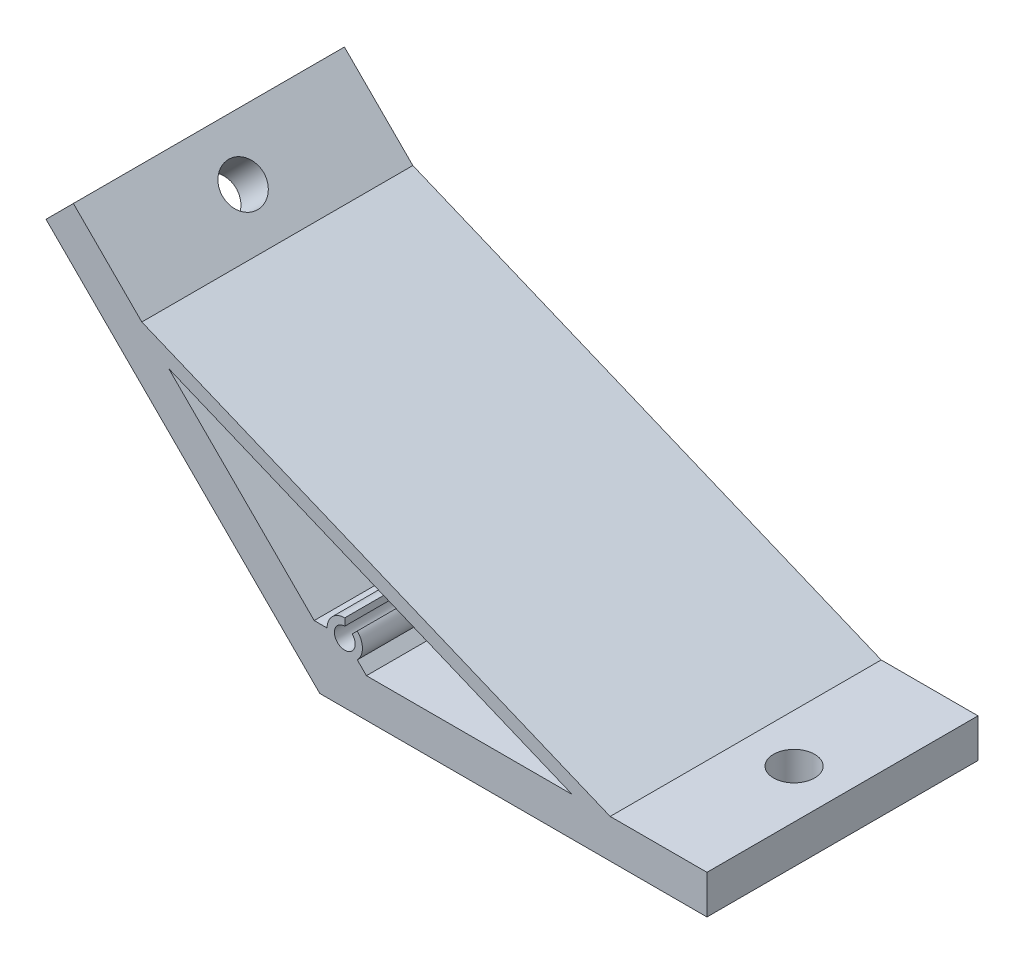
ISO-10303-21;
HEADER;
FILE_DESCRIPTION(('STEP AP214'),'2;1');
FILE_NAME('part.step','',(''),(''),'','','');
FILE_SCHEMA(('AUTOMOTIVE_DESIGN { 1 0 10303 214 1 1 1 1 }'));
ENDSEC;
DATA;
#1=APPLICATION_CONTEXT('core data for automotive mechanical design processes');
#2=APPLICATION_PROTOCOL_DEFINITION('international standard','automotive_design',2000,#1);
#3=PRODUCT_CONTEXT('',#1,'mechanical');
#4=PRODUCT('Part','Part','',(#3));
#5=PRODUCT_RELATED_PRODUCT_CATEGORY('part','',(#4));
#6=PRODUCT_DEFINITION_FORMATION('','',#4);
#7=PRODUCT_DEFINITION_CONTEXT('part definition',#1,'design');
#8=PRODUCT_DEFINITION('design','',#6,#7);
#9=PRODUCT_DEFINITION_SHAPE('','',#8);
#10=(LENGTH_UNIT() NAMED_UNIT(*) SI_UNIT(.MILLI.,.METRE.));
#11=(NAMED_UNIT(*) PLANE_ANGLE_UNIT() SI_UNIT($,.RADIAN.));
#12=(NAMED_UNIT(*) SI_UNIT($,.STERADIAN.) SOLID_ANGLE_UNIT());
#13=UNCERTAINTY_MEASURE_WITH_UNIT(LENGTH_MEASURE(1.E-05),#10,'distance_accuracy_value','');
#14=(GEOMETRIC_REPRESENTATION_CONTEXT(3) GLOBAL_UNCERTAINTY_ASSIGNED_CONTEXT((#13)) GLOBAL_UNIT_ASSIGNED_CONTEXT((#10,
#11,#12)) REPRESENTATION_CONTEXT('',''));
#15=CARTESIAN_POINT('',(0.,0.,0.));
#16=DIRECTION('',(0.,0.,1.));
#17=DIRECTION('',(1.,0.,0.));
#18=AXIS2_PLACEMENT_3D('',#15,#16,#17);
#19=CARTESIAN_POINT('',(-36.7695526216999,48.0832611206847,28.));
#20=DIRECTION('',(-0.707106781186536,-0.707106781186559,0.));
#21=DIRECTION('',(0.707106781186559,-0.707106781186536,0.));
#22=AXIS2_PLACEMENT_3D('',#19,#20,#21);
#23=PLANE('',#22);
#24=DIRECTION('',(-0.707106781186559,0.707106781186536,0.));
#25=VECTOR('',#24,1.);
#26=CARTESIAN_POINT('',(-36.7695526216999,48.0832611206847,-28.));
#27=LINE('',#26,#25);
#28=CARTESIAN_POINT('',(-36.7695526216999,48.0832611206847,-28.));
#29=VERTEX_POINT('',#28);
#30=CARTESIAN_POINT('',(-50.9116882454318,62.2253967444162,-28.));
#31=VERTEX_POINT('',#30);
#32=EDGE_CURVE('E260',#29,#31,#27,.T.);
#33=ORIENTED_EDGE('',*,*,#32,.T.);
#34=DIRECTION('',(0.,0.,-1.));
#35=VECTOR('',#34,1.);
#36=CARTESIAN_POINT('',(-50.9116882454318,62.2253967444162,28.));
#37=LINE('',#36,#35);
#38=CARTESIAN_POINT('',(-50.9116882454318,62.2253967444162,28.));
#39=VERTEX_POINT('',#38);
#40=EDGE_CURVE('E275',#39,#31,#37,.T.);
#41=ORIENTED_EDGE('',*,*,#40,.F.);
#42=DIRECTION('',(-0.707106781186559,0.707106781186536,0.));
#43=VECTOR('',#42,1.);
#44=CARTESIAN_POINT('',(-36.7695526216999,48.0832611206847,28.));
#45=LINE('',#44,#43);
#46=CARTESIAN_POINT('',(-36.7695526216999,48.0832611206847,28.));
#47=VERTEX_POINT('',#46);
#48=EDGE_CURVE('E245',#47,#39,#45,.T.);
#49=ORIENTED_EDGE('',*,*,#48,.F.);
#50=DIRECTION('',(0.,0.,-1.));
#51=VECTOR('',#50,1.);
#52=CARTESIAN_POINT('',(-36.7695526216999,48.0832611206847,28.));
#53=LINE('',#52,#51);
#54=EDGE_CURVE('E278',#47,#29,#53,.T.);
#55=ORIENTED_EDGE('',*,*,#54,.T.);
#56=EDGE_LOOP('',(#33,#41,#49,#55));
#57=FACE_BOUND('',#56,.T.);
#58=CARTESIAN_POINT('',(-43.840620433566,55.1543289325507,0.));
#59=DIRECTION('',(-0.707106781186552,-0.707106781186543,0.));
#60=DIRECTION('',(0.707106781186543,-0.707106781186552,0.));
#61=AXIS2_PLACEMENT_3D('',#58,#59,#60);
#62=CIRCLE('',#61,4.25000000000001);
#63=CARTESIAN_POINT('',(-40.8354166135232,52.1491251125078,0.));
#64=VERTEX_POINT('',#63);
#65=EDGE_CURVE('E325',#64,#64,#62,.T.);
#66=ORIENTED_EDGE('',*,*,#65,.T.);
#67=EDGE_LOOP('',(#66));
#68=FACE_BOUND('',#67,.T.);
#69=ADVANCED_FACE('F35',(#57,#68),#23,.F.);
#70=CARTESIAN_POINT('',(0.,0.,28.));
#71=DIRECTION('',(0.707106781186545,0.70710678118655,0.));
#72=DIRECTION('',(-0.70710678118655,0.707106781186545,0.));
#73=AXIS2_PLACEMENT_3D('',#70,#71,#72);
#74=PLANE('',#73);
#75=DIRECTION('',(0.70710678118655,-0.707106781186545,0.));
#76=VECTOR('',#75,1.);
#77=CARTESIAN_POINT('',(0.,0.,-28.));
#78=LINE('',#77,#76);
#79=CARTESIAN_POINT('',(-56.5685424949243,56.5685424949238,-28.));
#80=VERTEX_POINT('',#79);
#81=CARTESIAN_POINT('',(0.,0.,-28.));
#82=VERTEX_POINT('',#81);
#83=EDGE_CURVE('E264',#80,#82,#78,.T.);
#84=ORIENTED_EDGE('',*,*,#83,.T.);
#85=DIRECTION('',(0.,0.,-1.));
#86=VECTOR('',#85,1.);
#87=CARTESIAN_POINT('',(0.,0.,28.));
#88=LINE('',#87,#86);
#89=CARTESIAN_POINT('',(0.,0.,28.));
#90=VERTEX_POINT('',#89);
#91=EDGE_CURVE('E269',#90,#82,#88,.T.);
#92=ORIENTED_EDGE('',*,*,#91,.F.);
#93=DIRECTION('',(0.70710678118655,-0.707106781186545,0.));
#94=VECTOR('',#93,1.);
#95=CARTESIAN_POINT('',(0.,0.,28.));
#96=LINE('',#95,#94);
#97=CARTESIAN_POINT('',(-56.5685424949243,56.5685424949238,28.));
#98=VERTEX_POINT('',#97);
#99=EDGE_CURVE('E249',#98,#90,#96,.T.);
#100=ORIENTED_EDGE('',*,*,#99,.F.);
#101=DIRECTION('',(0.,0.,-1.));
#102=VECTOR('',#101,1.);
#103=CARTESIAN_POINT('',(-56.5685424949243,56.5685424949238,28.));
#104=LINE('',#103,#102);
#105=EDGE_CURVE('E272',#98,#80,#104,.T.);
#106=ORIENTED_EDGE('',*,*,#105,.T.);
#107=EDGE_LOOP('',(#84,#92,#100,#106));
#108=FACE_BOUND('',#107,.T.);
#109=CARTESIAN_POINT('',(-49.4974746830586,49.4974746830582,0.));
#110=DIRECTION('',(0.707106781186545,0.70710678118655,0.));
#111=DIRECTION('',(-0.70710678118655,0.707106781186545,0.));
#112=AXIS2_PLACEMENT_3D('',#109,#110,#111);
#113=CIRCLE('',#112,4.25000000000001);
#114=CARTESIAN_POINT('',(-52.5026785031014,52.502678503101,0.));
#115=VERTEX_POINT('',#114);
#116=EDGE_CURVE('E39',#115,#115,#113,.F.);
#117=ORIENTED_EDGE('',*,*,#116,.F.);
#118=EDGE_LOOP('',(#117));
#119=FACE_BOUND('',#118,.T.);
#120=ADVANCED_FACE('F317',(#108,#119),#74,.F.);
#121=CARTESIAN_POINT('',(0.,0.,28.));
#122=DIRECTION('',(0.,0.,-1.));
#123=DIRECTION('',(-1.,0.,0.));
#124=AXIS2_PLACEMENT_3D('',#121,#122,#123);
#125=PLANE('',#124);
#126=DIRECTION('',(0.,1.,0.));
#127=VECTOR('',#126,1.);
#128=CARTESIAN_POINT('',(80.,8.,28.));
#129=LINE('',#128,#127);
#130=CARTESIAN_POINT('',(80.,0.,28.));
#131=VERTEX_POINT('',#130);
#132=CARTESIAN_POINT('',(80.,8.,28.));
#133=VERTEX_POINT('',#132);
#134=EDGE_CURVE('E237',#131,#133,#129,.T.);
#135=ORIENTED_EDGE('',*,*,#134,.T.);
#136=DIRECTION('',(-1.,0.,0.));
#137=VECTOR('',#136,1.);
#138=CARTESIAN_POINT('',(80.,8.,28.));
#139=LINE('',#138,#137);
#140=CARTESIAN_POINT('',(59.9999999999991,7.99999999999989,28.));
#141=VERTEX_POINT('',#140);
#142=EDGE_CURVE('E240',#133,#141,#139,.T.);
#143=ORIENTED_EDGE('',*,*,#142,.T.);
#144=DIRECTION('',(-0.923879532511286,0.382683432365092,0.));
#145=VECTOR('',#144,1.);
#146=CARTESIAN_POINT('',(-36.7695526216999,48.0832611206847,28.));
#147=LINE('',#146,#145);
#148=EDGE_CURVE('E243',#141,#47,#147,.T.);
#149=ORIENTED_EDGE('',*,*,#148,.T.);
#150=ORIENTED_EDGE('',*,*,#48,.T.);
#151=DIRECTION('',(-0.707106781186548,-0.707106781186548,0.));
#152=VECTOR('',#151,1.);
#153=CARTESIAN_POINT('',(-50.9116882454318,62.2253967444162,28.));
#154=LINE('',#153,#152);
#155=EDGE_CURVE('E247',#39,#98,#154,.T.);
#156=ORIENTED_EDGE('',*,*,#155,.T.);
#157=ORIENTED_EDGE('',*,*,#99,.T.);
#158=DIRECTION('',(1.,0.,0.));
#159=VECTOR('',#158,1.);
#160=CARTESIAN_POINT('',(80.,0.,28.));
#161=LINE('',#160,#159);
#162=EDGE_CURVE('E251',#90,#131,#161,.T.);
#163=ORIENTED_EDGE('',*,*,#162,.T.);
#164=EDGE_LOOP('',(#135,#143,#149,#150,#156,#157,#163));
#165=FACE_BOUND('',#164,.T.);
#166=DIRECTION('',(-0.92387953251129,0.382683432365082,0.));
#167=VECTOR('',#166,1.);
#168=CARTESIAN_POINT('',(-31.2262754266308,42.5399839256161,28.));
#169=LINE('',#168,#167);
#170=CARTESIAN_POINT('',(52.1606222107425,7.99999999999989,28.));
#171=VERTEX_POINT('',#170);
#172=CARTESIAN_POINT('',(-31.2262754266308,42.5399839256161,28.));
#173=VERTEX_POINT('',#172);
#174=EDGE_CURVE('E155',#171,#173,#169,.T.);
#175=ORIENTED_EDGE('',*,*,#174,.F.);
#176=DIRECTION('',(1.,0.,0.));
#177=VECTOR('',#176,1.);
#178=CARTESIAN_POINT('',(52.1606222107425,7.99999999999989,28.));
#179=LINE('',#178,#177);
#180=CARTESIAN_POINT('',(9.63860002583124,8.,28.));
#181=VERTEX_POINT('',#180);
#182=EDGE_CURVE('E194',#181,#171,#179,.T.);
#183=ORIENTED_EDGE('',*,*,#182,.F.);
#184=DIRECTION('',(0.70710678118647,-0.707106781186625,0.));
#185=VECTOR('',#184,1.);
#186=CARTESIAN_POINT('',(9.63860002583124,8.,28.));
#187=LINE('',#186,#185);
#188=CARTESIAN_POINT('',(7.74716608826006,9.89143393757159,28.));
#189=VERTEX_POINT('',#188);
#190=EDGE_CURVE('E192',#189,#181,#187,.T.);
#191=ORIENTED_EDGE('',*,*,#190,.F.);
#192=CARTESIAN_POINT('',(5.16622633692896,12.4723736889023,28.));
#193=DIRECTION('',(0.,0.,-1.));
#194=DIRECTION('',(1.,0.,0.));
#195=AXIS2_PLACEMENT_3D('',#192,#193,#194);
#196=CIRCLE('',#195,3.65);
#197=CARTESIAN_POINT('',(7.74716608826007,15.053313440233,28.));
#198=VERTEX_POINT('',#197);
#199=EDGE_CURVE('E190',#198,#189,#196,.T.);
#200=ORIENTED_EDGE('',*,*,#199,.F.);
#201=DIRECTION('',(0.707106781186523,0.707106781186572,0.));
#202=VECTOR('',#201,1.);
#203=CARTESIAN_POINT('',(6.68650591648028,13.9926532684531,28.));
#204=LINE('',#203,#202);
#205=CARTESIAN_POINT('',(6.68650591648028,13.9926532684531,28.));
#206=VERTEX_POINT('',#205);
#207=EDGE_CURVE('E188',#206,#198,#204,.T.);
#208=ORIENTED_EDGE('',*,*,#207,.F.);
#209=CARTESIAN_POINT('',(5.16622633692896,12.4723736889023,28.));
#210=DIRECTION('',(0.,0.,1.));
#211=DIRECTION('',(1.,0.,0.));
#212=AXIS2_PLACEMENT_3D('',#209,#210,#211);
#213=CIRCLE('',#212,2.15);
#214=CARTESIAN_POINT('',(5.16622633692896,14.6223736889023,28.));
#215=VERTEX_POINT('',#214);
#216=EDGE_CURVE('E186',#215,#206,#213,.T.);
#217=ORIENTED_EDGE('',*,*,#216,.F.);
#218=DIRECTION('',(0.,-1.,0.));
#219=VECTOR('',#218,1.);
#220=CARTESIAN_POINT('',(5.16622633692896,14.6223736889023,28.));
#221=LINE('',#220,#219);
#222=CARTESIAN_POINT('',(5.16622633692896,16.1223736889023,28.));
#223=VERTEX_POINT('',#222);
#224=EDGE_CURVE('E184',#223,#215,#221,.T.);
#225=ORIENTED_EDGE('',*,*,#224,.F.);
#226=CARTESIAN_POINT('',(5.16622633692896,12.4723736889023,28.));
#227=DIRECTION('',(0.,0.,-1.));
#228=DIRECTION('',(1.,0.,0.));
#229=AXIS2_PLACEMENT_3D('',#226,#227,#228);
#230=CIRCLE('',#229,3.65);
#231=CARTESIAN_POINT('',(1.51622633692896,12.4723736889023,28.));
#232=VERTEX_POINT('',#231);
#233=EDGE_CURVE('E179',#232,#223,#230,.T.);
#234=ORIENTED_EDGE('',*,*,#233,.F.);
#235=DIRECTION('',(1.,0.,0.));
#236=VECTOR('',#235,1.);
#237=CARTESIAN_POINT('',(-1.15866518991743,12.4723736889023,28.));
#238=LINE('',#237,#236);
#239=CARTESIAN_POINT('',(-1.15866518991743,12.4723736889023,28.));
#240=VERTEX_POINT('',#239);
#241=EDGE_CURVE('E177',#240,#232,#238,.T.);
#242=ORIENTED_EDGE('',*,*,#241,.F.);
#243=DIRECTION('',(0.707106781186542,-0.707106781186553,0.));
#244=VECTOR('',#243,1.);
#245=CARTESIAN_POINT('',(-1.15866518991743,12.4723736889023,28.));
#246=LINE('',#245,#244);
#247=EDGE_CURVE('E163',#173,#240,#246,.T.);
#248=ORIENTED_EDGE('',*,*,#247,.F.);
#249=EDGE_LOOP('',(#175,#183,#191,#200,#208,#217,#225,#234,#242,#248));
#250=FACE_BOUND('',#249,.T.);
#251=ADVANCED_FACE('F175',(#165,#250),#125,.F.);
#252=CARTESIAN_POINT('',(0.,0.,-28.));
#253=DIRECTION('',(0.,0.,-1.));
#254=DIRECTION('',(-1.,0.,0.));
#255=AXIS2_PLACEMENT_3D('',#252,#253,#254);
#256=PLANE('',#255);
#257=DIRECTION('',(0.,1.,0.));
#258=VECTOR('',#257,1.);
#259=CARTESIAN_POINT('',(80.,8.,-28.));
#260=LINE('',#259,#258);
#261=CARTESIAN_POINT('',(80.,0.,-28.));
#262=VERTEX_POINT('',#261);
#263=CARTESIAN_POINT('',(80.,8.,-28.));
#264=VERTEX_POINT('',#263);
#265=EDGE_CURVE('E171',#262,#264,#260,.T.);
#266=ORIENTED_EDGE('',*,*,#265,.F.);
#267=DIRECTION('',(1.,0.,0.));
#268=VECTOR('',#267,1.);
#269=CARTESIAN_POINT('',(80.,0.,-28.));
#270=LINE('',#269,#268);
#271=EDGE_CURVE('E241',#82,#262,#270,.T.);
#272=ORIENTED_EDGE('',*,*,#271,.F.);
#273=ORIENTED_EDGE('',*,*,#83,.F.);
#274=DIRECTION('',(-0.707106781186548,-0.707106781186548,0.));
#275=VECTOR('',#274,1.);
#276=CARTESIAN_POINT('',(-50.9116882454318,62.2253967444162,-28.));
#277=LINE('',#276,#275);
#278=EDGE_CURVE('E262',#31,#80,#277,.T.);
#279=ORIENTED_EDGE('',*,*,#278,.F.);
#280=ORIENTED_EDGE('',*,*,#32,.F.);
#281=DIRECTION('',(-0.923879532511286,0.382683432365092,0.));
#282=VECTOR('',#281,1.);
#283=CARTESIAN_POINT('',(-36.7695526216999,48.0832611206847,-28.));
#284=LINE('',#283,#282);
#285=CARTESIAN_POINT('',(59.9999999999991,7.99999999999989,-28.));
#286=VERTEX_POINT('',#285);
#287=EDGE_CURVE('E258',#286,#29,#284,.T.);
#288=ORIENTED_EDGE('',*,*,#287,.F.);
#289=DIRECTION('',(-1.,0.,0.));
#290=VECTOR('',#289,1.);
#291=CARTESIAN_POINT('',(80.,8.,-28.));
#292=LINE('',#291,#290);
#293=EDGE_CURVE('E256',#264,#286,#292,.T.);
#294=ORIENTED_EDGE('',*,*,#293,.F.);
#295=EDGE_LOOP('',(#266,#272,#273,#279,#280,#288,#294));
#296=FACE_BOUND('',#295,.T.);
#297=DIRECTION('',(1.,0.,0.));
#298=VECTOR('',#297,1.);
#299=CARTESIAN_POINT('',(52.1606222107425,7.99999999999989,-28.));
#300=LINE('',#299,#298);
#301=CARTESIAN_POINT('',(9.63860002583124,8.,-28.));
#302=VERTEX_POINT('',#301);
#303=CARTESIAN_POINT('',(52.1606222107425,7.99999999999989,-28.));
#304=VERTEX_POINT('',#303);
#305=EDGE_CURVE('E164',#302,#304,#300,.T.);
#306=ORIENTED_EDGE('',*,*,#305,.T.);
#307=DIRECTION('',(-0.92387953251129,0.382683432365082,0.));
#308=VECTOR('',#307,1.);
#309=CARTESIAN_POINT('',(-31.2262754266308,42.5399839256161,-28.));
#310=LINE('',#309,#308);
#311=CARTESIAN_POINT('',(-31.2262754266308,42.5399839256161,-28.));
#312=VERTEX_POINT('',#311);
#313=EDGE_CURVE('E59',#304,#312,#310,.T.);
#314=ORIENTED_EDGE('',*,*,#313,.T.);
#315=DIRECTION('',(0.707106781186542,-0.707106781186553,0.));
#316=VECTOR('',#315,1.);
#317=CARTESIAN_POINT('',(-1.15866518991743,12.4723736889023,-28.));
#318=LINE('',#317,#316);
#319=CARTESIAN_POINT('',(-1.15866518991743,12.4723736889023,-28.));
#320=VERTEX_POINT('',#319);
#321=EDGE_CURVE('E170',#312,#320,#318,.T.);
#322=ORIENTED_EDGE('',*,*,#321,.T.);
#323=DIRECTION('',(1.,0.,0.));
#324=VECTOR('',#323,1.);
#325=CARTESIAN_POINT('',(-1.15866518991743,12.4723736889023,-28.));
#326=LINE('',#325,#324);
#327=CARTESIAN_POINT('',(1.51622633692896,12.4723736889023,-28.));
#328=VERTEX_POINT('',#327);
#329=EDGE_CURVE('E199',#320,#328,#326,.T.);
#330=ORIENTED_EDGE('',*,*,#329,.T.);
#331=CARTESIAN_POINT('',(5.16622633692896,12.4723736889023,-28.));
#332=DIRECTION('',(0.,0.,-1.));
#333=DIRECTION('',(1.,0.,0.));
#334=AXIS2_PLACEMENT_3D('',#331,#332,#333);
#335=CIRCLE('',#334,3.65);
#336=CARTESIAN_POINT('',(5.16622633692896,16.1223736889023,-28.));
#337=VERTEX_POINT('',#336);
#338=EDGE_CURVE('E202',#328,#337,#335,.T.);
#339=ORIENTED_EDGE('',*,*,#338,.T.);
#340=DIRECTION('',(0.,-1.,0.));
#341=VECTOR('',#340,1.);
#342=CARTESIAN_POINT('',(5.16622633692896,14.6223736889023,-28.));
#343=LINE('',#342,#341);
#344=CARTESIAN_POINT('',(5.16622633692896,14.6223736889023,-28.));
#345=VERTEX_POINT('',#344);
#346=EDGE_CURVE('E205',#337,#345,#343,.T.);
#347=ORIENTED_EDGE('',*,*,#346,.T.);
#348=CARTESIAN_POINT('',(5.16622633692896,12.4723736889023,-28.));
#349=DIRECTION('',(0.,0.,1.));
#350=DIRECTION('',(1.,0.,0.));
#351=AXIS2_PLACEMENT_3D('',#348,#349,#350);
#352=CIRCLE('',#351,2.15);
#353=CARTESIAN_POINT('',(6.68650591648028,13.9926532684531,-28.));
#354=VERTEX_POINT('',#353);
#355=EDGE_CURVE('E208',#345,#354,#352,.T.);
#356=ORIENTED_EDGE('',*,*,#355,.T.);
#357=DIRECTION('',(0.707106781186523,0.707106781186572,0.));
#358=VECTOR('',#357,1.);
#359=CARTESIAN_POINT('',(6.68650591648028,13.9926532684531,-28.));
#360=LINE('',#359,#358);
#361=CARTESIAN_POINT('',(7.74716608826007,15.053313440233,-28.));
#362=VERTEX_POINT('',#361);
#363=EDGE_CURVE('E211',#354,#362,#360,.T.);
#364=ORIENTED_EDGE('',*,*,#363,.T.);
#365=CARTESIAN_POINT('',(5.16622633692896,12.4723736889023,-28.));
#366=DIRECTION('',(0.,0.,-1.));
#367=DIRECTION('',(1.,0.,0.));
#368=AXIS2_PLACEMENT_3D('',#365,#366,#367);
#369=CIRCLE('',#368,3.65);
#370=CARTESIAN_POINT('',(7.74716608826006,9.89143393757159,-28.));
#371=VERTEX_POINT('',#370);
#372=EDGE_CURVE('E214',#362,#371,#369,.T.);
#373=ORIENTED_EDGE('',*,*,#372,.T.);
#374=DIRECTION('',(0.70710678118647,-0.707106781186625,0.));
#375=VECTOR('',#374,1.);
#376=CARTESIAN_POINT('',(9.63860002583124,8.,-28.));
#377=LINE('',#376,#375);
#378=EDGE_CURVE('E217',#371,#302,#377,.T.);
#379=ORIENTED_EDGE('',*,*,#378,.T.);
#380=EDGE_LOOP('',(#306,#314,#322,#330,#339,#347,#356,#364,#373,#379));
#381=FACE_BOUND('',#380,.T.);
#382=ADVANCED_FACE('F292',(#296,#381),#256,.T.);
#383=CARTESIAN_POINT('',(80.,8.,28.));
#384=DIRECTION('',(-1.,0.,0.));
#385=DIRECTION('',(0.,0.,1.));
#386=AXIS2_PLACEMENT_3D('',#383,#384,#385);
#387=PLANE('',#386);
#388=ORIENTED_EDGE('',*,*,#265,.T.);
#389=DIRECTION('',(0.,0.,-1.));
#390=VECTOR('',#389,1.);
#391=CARTESIAN_POINT('',(80.,8.,28.));
#392=LINE('',#391,#390);
#393=EDGE_CURVE('E11',#133,#264,#392,.T.);
#394=ORIENTED_EDGE('',*,*,#393,.F.);
#395=ORIENTED_EDGE('',*,*,#134,.F.);
#396=DIRECTION('',(0.,0.,-1.));
#397=VECTOR('',#396,1.);
#398=CARTESIAN_POINT('',(80.,0.,28.));
#399=LINE('',#398,#397);
#400=EDGE_CURVE('E253',#131,#262,#399,.T.);
#401=ORIENTED_EDGE('',*,*,#400,.T.);
#402=EDGE_LOOP('',(#388,#394,#395,#401));
#403=FACE_BOUND('',#402,.T.);
#404=ADVANCED_FACE('F37',(#403),#387,.F.);
#405=CARTESIAN_POINT('',(80.,8.,28.));
#406=DIRECTION('',(0.,-1.,0.));
#407=DIRECTION('',(1.,0.,0.));
#408=AXIS2_PLACEMENT_3D('',#405,#406,#407);
#409=PLANE('',#408);
#410=CARTESIAN_POINT('',(70.,7.99999999999994,0.));
#411=DIRECTION('',(0.,1.,0.));
#412=DIRECTION('',(-1.,0.,0.));
#413=AXIS2_PLACEMENT_3D('',#410,#411,#412);
#414=CIRCLE('',#413,4.25000000000001);
#415=CARTESIAN_POINT('',(65.75,7.99999999999992,0.));
#416=VERTEX_POINT('',#415);
#417=EDGE_CURVE('E324',#416,#416,#414,.T.);
#418=ORIENTED_EDGE('',*,*,#417,.F.);
#419=EDGE_LOOP('',(#418));
#420=FACE_BOUND('',#419,.T.);
#421=ORIENTED_EDGE('',*,*,#293,.T.);
#422=DIRECTION('',(0.,0.,-1.));
#423=VECTOR('',#422,1.);
#424=CARTESIAN_POINT('',(59.9999999999991,7.99999999999989,28.));
#425=LINE('',#424,#423);
#426=EDGE_CURVE('E44',#141,#286,#425,.T.);
#427=ORIENTED_EDGE('',*,*,#426,.F.);
#428=ORIENTED_EDGE('',*,*,#142,.F.);
#429=ORIENTED_EDGE('',*,*,#393,.T.);
#430=EDGE_LOOP('',(#421,#427,#428,#429));
#431=FACE_BOUND('',#430,.T.);
#432=ADVANCED_FACE('F309',(#420,#431),#409,.F.);
#433=CARTESIAN_POINT('',(-36.7695526216999,48.0832611206847,28.));
#434=DIRECTION('',(-0.382683432365092,-0.923879532511286,0.));
#435=DIRECTION('',(0.923879532511286,-0.382683432365092,0.));
#436=AXIS2_PLACEMENT_3D('',#433,#434,#435);
#437=PLANE('',#436);
#438=ORIENTED_EDGE('',*,*,#287,.T.);
#439=ORIENTED_EDGE('',*,*,#54,.F.);
#440=ORIENTED_EDGE('',*,*,#148,.F.);
#441=ORIENTED_EDGE('',*,*,#426,.T.);
#442=EDGE_LOOP('',(#438,#439,#440,#441));
#443=FACE_BOUND('',#442,.T.);
#444=ADVANCED_FACE('F286',(#443),#437,.F.);
#445=CARTESIAN_POINT('',(-50.9116882454318,62.2253967444162,28.));
#446=DIRECTION('',(0.707106781186547,-0.707106781186547,0.));
#447=DIRECTION('',(0.707106781186548,0.707106781186548,0.));
#448=AXIS2_PLACEMENT_3D('',#445,#446,#447);
#449=PLANE('',#448);
#450=ORIENTED_EDGE('',*,*,#278,.T.);
#451=ORIENTED_EDGE('',*,*,#105,.F.);
#452=ORIENTED_EDGE('',*,*,#155,.F.);
#453=ORIENTED_EDGE('',*,*,#40,.T.);
#454=EDGE_LOOP('',(#450,#451,#452,#453));
#455=FACE_BOUND('',#454,.T.);
#456=ADVANCED_FACE('F302',(#455),#449,.F.);
#457=CARTESIAN_POINT('',(80.,0.,28.));
#458=DIRECTION('',(0.,1.,0.));
#459=DIRECTION('',(0.,0.,1.));
#460=AXIS2_PLACEMENT_3D('',#457,#458,#459);
#461=PLANE('',#460);
#462=CARTESIAN_POINT('',(70.,0.,0.));
#463=DIRECTION('',(0.,1.,0.));
#464=DIRECTION('',(-1.,0.,0.));
#465=AXIS2_PLACEMENT_3D('',#462,#463,#464);
#466=CIRCLE('',#465,4.25000000000001);
#467=CARTESIAN_POINT('',(65.75,0.,0.));
#468=VERTEX_POINT('',#467);
#469=EDGE_CURVE('E197',#468,#468,#466,.T.);
#470=ORIENTED_EDGE('',*,*,#469,.T.);
#471=EDGE_LOOP('',(#470));
#472=FACE_BOUND('',#471,.T.);
#473=ORIENTED_EDGE('',*,*,#271,.T.);
#474=ORIENTED_EDGE('',*,*,#400,.F.);
#475=ORIENTED_EDGE('',*,*,#162,.F.);
#476=ORIENTED_EDGE('',*,*,#91,.T.);
#477=EDGE_LOOP('',(#473,#474,#475,#476));
#478=FACE_BOUND('',#477,.T.);
#479=ADVANCED_FACE('F314',(#472,#478),#461,.F.);
#480=CARTESIAN_POINT('',(-31.2262754266308,42.5399839256161,28.));
#481=DIRECTION('',(-0.382683432365082,-0.92387953251129,0.));
#482=DIRECTION('',(0.92387953251129,-0.382683432365082,0.));
#483=AXIS2_PLACEMENT_3D('',#480,#481,#482);
#484=PLANE('',#483);
#485=ORIENTED_EDGE('',*,*,#313,.F.);
#486=DIRECTION('',(0.,0.,-1.));
#487=VECTOR('',#486,1.);
#488=CARTESIAN_POINT('',(52.1606222107425,7.99999999999989,28.));
#489=LINE('',#488,#487);
#490=EDGE_CURVE('E159',#171,#304,#489,.T.);
#491=ORIENTED_EDGE('',*,*,#490,.F.);
#492=ORIENTED_EDGE('',*,*,#174,.T.);
#493=DIRECTION('',(0.,0.,-1.));
#494=VECTOR('',#493,1.);
#495=CARTESIAN_POINT('',(-31.2262754266308,42.5399839256161,28.));
#496=LINE('',#495,#494);
#497=EDGE_CURVE('E158',#173,#312,#496,.T.);
#498=ORIENTED_EDGE('',*,*,#497,.T.);
#499=EDGE_LOOP('',(#485,#491,#492,#498));
#500=FACE_BOUND('',#499,.T.);
#501=ADVANCED_FACE('F157',(#500),#484,.T.);
#502=CARTESIAN_POINT('',(-1.15866518991743,12.4723736889023,28.));
#503=DIRECTION('',(0.707106781186553,0.707106781186542,0.));
#504=DIRECTION('',(-0.707106781186542,0.707106781186553,0.));
#505=AXIS2_PLACEMENT_3D('',#502,#503,#504);
#506=PLANE('',#505);
#507=ORIENTED_EDGE('',*,*,#321,.F.);
#508=ORIENTED_EDGE('',*,*,#497,.F.);
#509=ORIENTED_EDGE('',*,*,#247,.T.);
#510=DIRECTION('',(0.,0.,-1.));
#511=VECTOR('',#510,1.);
#512=CARTESIAN_POINT('',(-1.15866518991743,12.4723736889023,28.));
#513=LINE('',#512,#511);
#514=EDGE_CURVE('E172',#240,#320,#513,.T.);
#515=ORIENTED_EDGE('',*,*,#514,.T.);
#516=EDGE_LOOP('',(#507,#508,#509,#515));
#517=FACE_BOUND('',#516,.T.);
#518=ADVANCED_FACE('F167',(#517),#506,.T.);
#519=CARTESIAN_POINT('',(-1.15866518991743,12.4723736889023,28.));
#520=DIRECTION('',(0.,1.,0.));
#521=DIRECTION('',(0.,0.,1.));
#522=AXIS2_PLACEMENT_3D('',#519,#520,#521);
#523=PLANE('',#522);
#524=ORIENTED_EDGE('',*,*,#329,.F.);
#525=ORIENTED_EDGE('',*,*,#514,.F.);
#526=ORIENTED_EDGE('',*,*,#241,.T.);
#527=DIRECTION('',(0.,0.,-1.));
#528=VECTOR('',#527,1.);
#529=CARTESIAN_POINT('',(1.51622633692896,12.4723736889023,28.));
#530=LINE('',#529,#528);
#531=EDGE_CURVE('E234',#232,#328,#530,.T.);
#532=ORIENTED_EDGE('',*,*,#531,.T.);
#533=EDGE_LOOP('',(#524,#525,#526,#532));
#534=FACE_BOUND('',#533,.T.);
#535=ADVANCED_FACE('F366',(#534),#523,.T.);
#536=CARTESIAN_POINT('',(5.16622633692896,12.4723736889023,28.));
#537=DIRECTION('',(0.,0.,-1.));
#538=DIRECTION('',(-1.,0.,0.));
#539=AXIS2_PLACEMENT_3D('',#536,#537,#538);
#540=CYLINDRICAL_SURFACE('',#539,3.65);
#541=ORIENTED_EDGE('',*,*,#338,.F.);
#542=ORIENTED_EDGE('',*,*,#531,.F.);
#543=ORIENTED_EDGE('',*,*,#233,.T.);
#544=DIRECTION('',(0.,0.,-1.));
#545=VECTOR('',#544,1.);
#546=CARTESIAN_POINT('',(5.16622633692896,16.1223736889023,28.));
#547=LINE('',#546,#545);
#548=EDGE_CURVE('E232',#223,#337,#547,.T.);
#549=ORIENTED_EDGE('',*,*,#548,.T.);
#550=EDGE_LOOP('',(#541,#542,#543,#549));
#551=FACE_BOUND('',#550,.T.);
#552=ADVANCED_FACE('F369',(#551),#540,.T.);
#553=CARTESIAN_POINT('',(5.16622633692896,14.6223736889023,28.));
#554=DIRECTION('',(1.,0.,0.));
#555=DIRECTION('',(0.,0.,-1.));
#556=AXIS2_PLACEMENT_3D('',#553,#554,#555);
#557=PLANE('',#556);
#558=ORIENTED_EDGE('',*,*,#346,.F.);
#559=ORIENTED_EDGE('',*,*,#548,.F.);
#560=ORIENTED_EDGE('',*,*,#224,.T.);
#561=DIRECTION('',(0.,0.,-1.));
#562=VECTOR('',#561,1.);
#563=CARTESIAN_POINT('',(5.16622633692896,14.6223736889023,28.));
#564=LINE('',#563,#562);
#565=EDGE_CURVE('E230',#215,#345,#564,.T.);
#566=ORIENTED_EDGE('',*,*,#565,.T.);
#567=EDGE_LOOP('',(#558,#559,#560,#566));
#568=FACE_BOUND('',#567,.T.);
#569=ADVANCED_FACE('F373',(#568),#557,.T.);
#570=CARTESIAN_POINT('',(5.16622633692896,12.4723736889023,28.));
#571=DIRECTION('',(0.,0.,-1.));
#572=DIRECTION('',(-1.,0.,0.));
#573=AXIS2_PLACEMENT_3D('',#570,#571,#572);
#574=CYLINDRICAL_SURFACE('',#573,2.15);
#575=ORIENTED_EDGE('',*,*,#355,.F.);
#576=ORIENTED_EDGE('',*,*,#565,.F.);
#577=ORIENTED_EDGE('',*,*,#216,.T.);
#578=DIRECTION('',(0.,0.,-1.));
#579=VECTOR('',#578,1.);
#580=CARTESIAN_POINT('',(6.68650591648028,13.9926532684531,28.));
#581=LINE('',#580,#579);
#582=EDGE_CURVE('E228',#206,#354,#581,.T.);
#583=ORIENTED_EDGE('',*,*,#582,.T.);
#584=EDGE_LOOP('',(#575,#576,#577,#583));
#585=FACE_BOUND('',#584,.T.);
#586=ADVANCED_FACE('F377',(#585),#574,.F.);
#587=CARTESIAN_POINT('',(6.68650591648028,13.9926532684531,28.));
#588=DIRECTION('',(-0.707106781186572,0.707106781186523,0.));
#589=DIRECTION('',(-0.707106781186523,-0.707106781186572,0.));
#590=AXIS2_PLACEMENT_3D('',#587,#588,#589);
#591=PLANE('',#590);
#592=ORIENTED_EDGE('',*,*,#363,.F.);
#593=ORIENTED_EDGE('',*,*,#582,.F.);
#594=ORIENTED_EDGE('',*,*,#207,.T.);
#595=DIRECTION('',(0.,0.,-1.));
#596=VECTOR('',#595,1.);
#597=CARTESIAN_POINT('',(7.74716608826007,15.053313440233,28.));
#598=LINE('',#597,#596);
#599=EDGE_CURVE('E226',#198,#362,#598,.T.);
#600=ORIENTED_EDGE('',*,*,#599,.T.);
#601=EDGE_LOOP('',(#592,#593,#594,#600));
#602=FACE_BOUND('',#601,.T.);
#603=ADVANCED_FACE('F381',(#602),#591,.T.);
#604=CARTESIAN_POINT('',(5.16622633692896,12.4723736889023,28.));
#605=DIRECTION('',(0.,0.,-1.));
#606=DIRECTION('',(-1.,0.,0.));
#607=AXIS2_PLACEMENT_3D('',#604,#605,#606);
#608=CYLINDRICAL_SURFACE('',#607,3.65);
#609=ORIENTED_EDGE('',*,*,#372,.F.);
#610=ORIENTED_EDGE('',*,*,#599,.F.);
#611=ORIENTED_EDGE('',*,*,#199,.T.);
#612=DIRECTION('',(0.,0.,-1.));
#613=VECTOR('',#612,1.);
#614=CARTESIAN_POINT('',(7.74716608826006,9.89143393757159,28.));
#615=LINE('',#614,#613);
#616=EDGE_CURVE('E224',#189,#371,#615,.T.);
#617=ORIENTED_EDGE('',*,*,#616,.T.);
#618=EDGE_LOOP('',(#609,#610,#611,#617));
#619=FACE_BOUND('',#618,.T.);
#620=ADVANCED_FACE('F385',(#619),#608,.T.);
#621=CARTESIAN_POINT('',(9.63860002583124,8.,28.));
#622=DIRECTION('',(0.707106781186625,0.70710678118647,0.));
#623=DIRECTION('',(-0.70710678118647,0.707106781186625,0.));
#624=AXIS2_PLACEMENT_3D('',#621,#622,#623);
#625=PLANE('',#624);
#626=ORIENTED_EDGE('',*,*,#378,.F.);
#627=ORIENTED_EDGE('',*,*,#616,.F.);
#628=ORIENTED_EDGE('',*,*,#190,.T.);
#629=DIRECTION('',(0.,0.,-1.));
#630=VECTOR('',#629,1.);
#631=CARTESIAN_POINT('',(9.63860002583124,8.,28.));
#632=LINE('',#631,#630);
#633=EDGE_CURVE('E51',#181,#302,#632,.T.);
#634=ORIENTED_EDGE('',*,*,#633,.T.);
#635=EDGE_LOOP('',(#626,#627,#628,#634));
#636=FACE_BOUND('',#635,.T.);
#637=ADVANCED_FACE('F389',(#636),#625,.T.);
#638=CARTESIAN_POINT('',(52.1606222107425,7.99999999999989,28.));
#639=DIRECTION('',(0.,1.,0.));
#640=DIRECTION('',(-1.,0.,0.));
#641=AXIS2_PLACEMENT_3D('',#638,#639,#640);
#642=PLANE('',#641);
#643=ORIENTED_EDGE('',*,*,#305,.F.);
#644=ORIENTED_EDGE('',*,*,#633,.F.);
#645=ORIENTED_EDGE('',*,*,#182,.T.);
#646=ORIENTED_EDGE('',*,*,#490,.T.);
#647=EDGE_LOOP('',(#643,#644,#645,#646));
#648=FACE_BOUND('',#647,.T.);
#649=ADVANCED_FACE('F339',(#648),#642,.T.);
#650=CARTESIAN_POINT('',(70.,0.,0.));
#651=DIRECTION('',(0.,1.,0.));
#652=DIRECTION('',(-1.,0.,0.));
#653=AXIS2_PLACEMENT_3D('',#650,#651,#652);
#654=CYLINDRICAL_SURFACE('',#653,4.25000000000001);
#655=ORIENTED_EDGE('',*,*,#469,.F.);
#656=EDGE_LOOP('',(#655));
#657=FACE_BOUND('',#656,.T.);
#658=ORIENTED_EDGE('',*,*,#417,.T.);
#659=EDGE_LOOP('',(#658));
#660=FACE_BOUND('',#659,.T.);
#661=ADVANCED_FACE('F335',(#657,#660),#654,.F.);
#662=CARTESIAN_POINT('',(-77.7817459305206,21.2132034355965,0.));
#663=DIRECTION('',(0.707106781186552,0.707106781186544,0.));
#664=DIRECTION('',(-0.707106781186544,0.707106781186552,0.));
#665=AXIS2_PLACEMENT_3D('',#662,#663,#664);
#666=CYLINDRICAL_SURFACE('',#665,4.25000000000001);
#667=ORIENTED_EDGE('',*,*,#65,.F.);
#668=EDGE_LOOP('',(#667));
#669=FACE_BOUND('',#668,.T.);
#670=ORIENTED_EDGE('',*,*,#116,.T.);
#671=EDGE_LOOP('',(#670));
#672=FACE_BOUND('',#671,.T.);
#673=ADVANCED_FACE('F338',(#669,#672),#666,.F.);
#674=CLOSED_SHELL('',(#69,#120,#251,#382,#404,#432,#444,#456,#479,#501,#518,#535,#552,#569,#586,
#603,#620,#637,#649,#661,#673));
#675=MANIFOLD_SOLID_BREP('B2',#674);
#676=ADVANCED_BREP_SHAPE_REPRESENTATION('',(#18,#675),#14);
#677=SHAPE_DEFINITION_REPRESENTATION(#9,#676);
ENDSEC;
END-ISO-10303-21;
